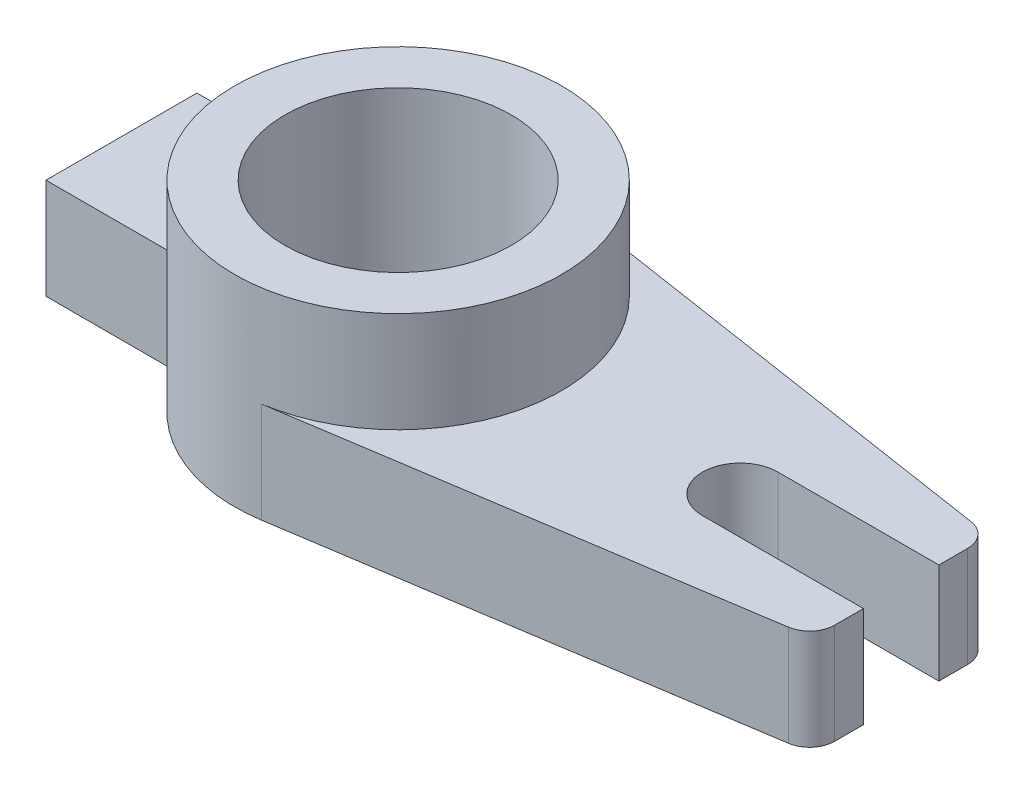
ISO-10303-21;
HEADER;
FILE_DESCRIPTION(('STEP AP214'),'2;1');
FILE_NAME('part.step','',(''),(''),'','','');
FILE_SCHEMA(('AUTOMOTIVE_DESIGN { 1 0 10303 214 1 1 1 1 }'));
ENDSEC;
DATA;
#1=APPLICATION_CONTEXT('core data for automotive mechanical design processes');
#2=APPLICATION_PROTOCOL_DEFINITION('international standard','automotive_design',2000,#1);
#3=PRODUCT_CONTEXT('',#1,'mechanical');
#4=PRODUCT('Part','Part','',(#3));
#5=PRODUCT_RELATED_PRODUCT_CATEGORY('part','',(#4));
#6=PRODUCT_DEFINITION_FORMATION('','',#4);
#7=PRODUCT_DEFINITION_CONTEXT('part definition',#1,'design');
#8=PRODUCT_DEFINITION('design','',#6,#7);
#9=PRODUCT_DEFINITION_SHAPE('','',#8);
#10=(LENGTH_UNIT() NAMED_UNIT(*) SI_UNIT(.MILLI.,.METRE.));
#11=(NAMED_UNIT(*) PLANE_ANGLE_UNIT() SI_UNIT($,.RADIAN.));
#12=(NAMED_UNIT(*) SI_UNIT($,.STERADIAN.) SOLID_ANGLE_UNIT());
#13=UNCERTAINTY_MEASURE_WITH_UNIT(LENGTH_MEASURE(1.E-05),#10,'distance_accuracy_value','');
#14=(GEOMETRIC_REPRESENTATION_CONTEXT(3) GLOBAL_UNCERTAINTY_ASSIGNED_CONTEXT((#13)) GLOBAL_UNIT_ASSIGNED_CONTEXT((#10,
#11,#12)) REPRESENTATION_CONTEXT('',''));
#15=CARTESIAN_POINT('',(0.,0.,0.));
#16=DIRECTION('',(0.,0.,1.));
#17=DIRECTION('',(1.,0.,0.));
#18=AXIS2_PLACEMENT_3D('',#15,#16,#17);
#19=CARTESIAN_POINT('',(0.,20.,0.));
#20=DIRECTION('',(0.,1.,0.));
#21=DIRECTION('',(0.,0.,1.));
#22=AXIS2_PLACEMENT_3D('',#19,#20,#21);
#23=PLANE('',#22);
#24=DIRECTION('',(-1.,0.,0.));
#25=VECTOR('',#24,1.);
#26=CARTESIAN_POINT('',(0.,20.,15.));
#27=LINE('',#26,#25);
#28=CARTESIAN_POINT('',(-28.831406486677,20.,15.));
#29=VERTEX_POINT('',#28);
#30=CARTESIAN_POINT('',(-55.,20.,15.));
#31=VERTEX_POINT('',#30);
#32=EDGE_CURVE('E153',#29,#31,#27,.T.);
#33=ORIENTED_EDGE('',*,*,#32,.F.);
#34=CARTESIAN_POINT('',(0.,20.,0.));
#35=DIRECTION('',(0.,1.,0.));
#36=DIRECTION('',(0.,0.,1.));
#37=AXIS2_PLACEMENT_3D('',#34,#35,#36);
#38=CIRCLE('',#37,32.5);
#39=CARTESIAN_POINT('',(-28.831406486677,20.,-15.));
#40=VERTEX_POINT('',#39);
#41=EDGE_CURVE('E148',#29,#40,#38,.F.);
#42=ORIENTED_EDGE('',*,*,#41,.T.);
#43=DIRECTION('',(1.,0.,0.));
#44=VECTOR('',#43,1.);
#45=CARTESIAN_POINT('',(0.,20.,-15.));
#46=LINE('',#45,#44);
#47=CARTESIAN_POINT('',(-55.,20.,-15.));
#48=VERTEX_POINT('',#47);
#49=EDGE_CURVE('E152',#48,#40,#46,.T.);
#50=ORIENTED_EDGE('',*,*,#49,.F.);
#51=DIRECTION('',(0.,0.,-1.));
#52=VECTOR('',#51,1.);
#53=CARTESIAN_POINT('',(-55.,20.,0.));
#54=LINE('',#53,#52);
#55=EDGE_CURVE('E173',#31,#48,#54,.T.);
#56=ORIENTED_EDGE('',*,*,#55,.F.);
#57=EDGE_LOOP('',(#33,#42,#50,#56));
#58=FACE_BOUND('',#57,.T.);
#59=ADVANCED_FACE('F45',(#58),#23,.T.);
#60=DIRECTION('',(-0.988375212209647,0.,-0.152034337863312));
#61=VECTOR('',#60,1.);
#62=CARTESIAN_POINT('',(4.94111598055764,20.,-32.1221943968135));
#63=LINE('',#62,#61);
#64=CARTESIAN_POINT('',(95.7601716893165,20.,-18.1521809550725));
#65=VERTEX_POINT('',#64);
#66=CARTESIAN_POINT('',(4.94111598055764,20.,-32.1221943968135));
#67=VERTEX_POINT('',#66);
#68=EDGE_CURVE('E174',#65,#67,#63,.T.);
#69=ORIENTED_EDGE('',*,*,#68,.T.);
#70=CARTESIAN_POINT('',(4.94111598055764,20.,32.1221943968135));
#71=VERTEX_POINT('',#70);
#72=EDGE_CURVE('E157',#67,#71,#38,.F.);
#73=ORIENTED_EDGE('',*,*,#72,.T.);
#74=DIRECTION('',(-0.988375212209647,0.,0.152034337863312));
#75=VECTOR('',#74,1.);
#76=CARTESIAN_POINT('',(4.94111598055764,20.,32.1221943968135));
#77=LINE('',#76,#75);
#78=CARTESIAN_POINT('',(95.7601716893165,20.,18.1521809550725));
#79=VERTEX_POINT('',#78);
#80=EDGE_CURVE('E271',#79,#71,#77,.T.);
#81=ORIENTED_EDGE('',*,*,#80,.F.);
#82=CARTESIAN_POINT('',(95.,20.,13.2103048940243));
#83=DIRECTION('',(0.,1.,0.));
#84=DIRECTION('',(0.,0.,1.));
#85=AXIS2_PLACEMENT_3D('',#82,#83,#84);
#86=CIRCLE('',#85,5.);
#87=CARTESIAN_POINT('',(100.,20.,13.2103048940242));
#88=VERTEX_POINT('',#87);
#89=EDGE_CURVE('E294',#79,#88,#86,.T.);
#90=ORIENTED_EDGE('',*,*,#89,.T.);
#91=DIRECTION('',(0.,0.,-1.));
#92=VECTOR('',#91,1.);
#93=CARTESIAN_POINT('',(100.,20.,0.));
#94=LINE('',#93,#92);
#95=CARTESIAN_POINT('',(100.,20.,7.5));
#96=VERTEX_POINT('',#95);
#97=EDGE_CURVE('E289',#88,#96,#94,.T.);
#98=ORIENTED_EDGE('',*,*,#97,.T.);
#99=DIRECTION('',(-1.,0.,0.));
#100=VECTOR('',#99,1.);
#101=CARTESIAN_POINT('',(0.,20.,7.49999999999999));
#102=LINE('',#101,#100);
#103=CARTESIAN_POINT('',(68.,20.,7.5));
#104=VERTEX_POINT('',#103);
#105=EDGE_CURVE('E293',#96,#104,#102,.T.);
#106=ORIENTED_EDGE('',*,*,#105,.T.);
#107=CARTESIAN_POINT('',(68.,20.,0.));
#108=DIRECTION('',(0.,1.,0.));
#109=DIRECTION('',(0.,0.,1.));
#110=AXIS2_PLACEMENT_3D('',#107,#108,#109);
#111=CIRCLE('',#110,7.5);
#112=CARTESIAN_POINT('',(68.,20.,-7.5));
#113=VERTEX_POINT('',#112);
#114=EDGE_CURVE('E298',#113,#104,#111,.T.);
#115=ORIENTED_EDGE('',*,*,#114,.F.);
#116=DIRECTION('',(-1.,0.,0.));
#117=VECTOR('',#116,1.);
#118=CARTESIAN_POINT('',(0.,20.,-7.49999999999999));
#119=LINE('',#118,#117);
#120=CARTESIAN_POINT('',(100.,20.,-7.5));
#121=VERTEX_POINT('',#120);
#122=EDGE_CURVE('E306',#121,#113,#119,.T.);
#123=ORIENTED_EDGE('',*,*,#122,.F.);
#124=DIRECTION('',(0.,0.,1.));
#125=VECTOR('',#124,1.);
#126=CARTESIAN_POINT('',(100.,20.,0.));
#127=LINE('',#126,#125);
#128=CARTESIAN_POINT('',(100.,20.,-13.2103048940242));
#129=VERTEX_POINT('',#128);
#130=EDGE_CURVE('E310',#129,#121,#127,.T.);
#131=ORIENTED_EDGE('',*,*,#130,.F.);
#132=CARTESIAN_POINT('',(95.,20.,-13.2103048940243));
#133=DIRECTION('',(0.,1.,0.));
#134=DIRECTION('',(0.,0.,1.));
#135=AXIS2_PLACEMENT_3D('',#132,#133,#134);
#136=CIRCLE('',#135,5.);
#137=EDGE_CURVE('E179',#129,#65,#136,.T.);
#138=ORIENTED_EDGE('',*,*,#137,.T.);
#139=EDGE_LOOP('',(#69,#73,#81,#90,#98,#106,#115,#123,#131,#138));
#140=FACE_BOUND('',#139,.T.);
#141=ADVANCED_FACE('F317',(#140),#23,.T.);
#142=CARTESIAN_POINT('',(0.,20.,15.));
#143=DIRECTION('',(0.,0.,1.));
#144=DIRECTION('',(1.,0.,0.));
#145=AXIS2_PLACEMENT_3D('',#142,#143,#144);
#146=PLANE('',#145);
#147=DIRECTION('',(-1.,0.,0.));
#148=VECTOR('',#147,1.);
#149=CARTESIAN_POINT('',(0.,0.,15.));
#150=LINE('',#149,#148);
#151=CARTESIAN_POINT('',(-28.831406486677,0.,15.));
#152=VERTEX_POINT('',#151);
#153=CARTESIAN_POINT('',(-55.,0.,15.));
#154=VERTEX_POINT('',#153);
#155=EDGE_CURVE('E156',#152,#154,#150,.T.);
#156=ORIENTED_EDGE('',*,*,#155,.F.);
#157=DIRECTION('',(0.,-1.,0.));
#158=VECTOR('',#157,1.);
#159=CARTESIAN_POINT('',(-28.831406486677,20.,15.));
#160=LINE('',#159,#158);
#161=EDGE_CURVE('E11',#29,#152,#160,.T.);
#162=ORIENTED_EDGE('',*,*,#161,.F.);
#163=ORIENTED_EDGE('',*,*,#32,.T.);
#164=DIRECTION('',(0.,-1.,0.));
#165=VECTOR('',#164,1.);
#166=CARTESIAN_POINT('',(-55.,20.,15.));
#167=LINE('',#166,#165);
#168=EDGE_CURVE('E63',#31,#154,#167,.T.);
#169=ORIENTED_EDGE('',*,*,#168,.T.);
#170=EDGE_LOOP('',(#156,#162,#163,#169));
#171=FACE_BOUND('',#170,.T.);
#172=ADVANCED_FACE('F47',(#171),#146,.T.);
#173=CARTESIAN_POINT('',(4.94111598055764,20.,32.1221943968135));
#174=DIRECTION('',(0.152034337863312,0.,0.988375212209647));
#175=DIRECTION('',(0.988375212209647,0.,-0.152034337863312));
#176=AXIS2_PLACEMENT_3D('',#173,#174,#175);
#177=PLANE('',#176);
#178=DIRECTION('',(-0.988375212209647,0.,0.152034337863312));
#179=VECTOR('',#178,1.);
#180=CARTESIAN_POINT('',(4.94111598055764,0.,32.1221943968135));
#181=LINE('',#180,#179);
#182=CARTESIAN_POINT('',(95.7601716893165,0.,18.1521809550725));
#183=VERTEX_POINT('',#182);
#184=CARTESIAN_POINT('',(4.94111598055764,0.,32.1221943968135));
#185=VERTEX_POINT('',#184);
#186=EDGE_CURVE('E189',#183,#185,#181,.T.);
#187=ORIENTED_EDGE('',*,*,#186,.F.);
#188=DIRECTION('',(0.,-1.,0.));
#189=VECTOR('',#188,1.);
#190=CARTESIAN_POINT('',(95.7601716893165,20.,18.1521809550725));
#191=LINE('',#190,#189);
#192=EDGE_CURVE('E262',#79,#183,#191,.T.);
#193=ORIENTED_EDGE('',*,*,#192,.F.);
#194=ORIENTED_EDGE('',*,*,#80,.T.);
#195=DIRECTION('',(0.,-1.,0.));
#196=VECTOR('',#195,1.);
#197=CARTESIAN_POINT('',(4.94111598055764,20.,32.1221943968135));
#198=LINE('',#197,#196);
#199=EDGE_CURVE('E55',#71,#185,#198,.T.);
#200=ORIENTED_EDGE('',*,*,#199,.T.);
#201=EDGE_LOOP('',(#187,#193,#194,#200));
#202=FACE_BOUND('',#201,.T.);
#203=ADVANCED_FACE('F269',(#202),#177,.T.);
#204=CARTESIAN_POINT('',(95.,20.,13.2103048940243));
#205=DIRECTION('',(0.,-1.,0.));
#206=DIRECTION('',(0.,0.,-1.));
#207=AXIS2_PLACEMENT_3D('',#204,#205,#206);
#208=CYLINDRICAL_SURFACE('',#207,5.);
#209=CARTESIAN_POINT('',(95.,0.,13.2103048940243));
#210=DIRECTION('',(0.,1.,0.));
#211=DIRECTION('',(0.,0.,1.));
#212=AXIS2_PLACEMENT_3D('',#209,#210,#211);
#213=CIRCLE('',#212,5.);
#214=CARTESIAN_POINT('',(100.,0.,13.2103048940242));
#215=VERTEX_POINT('',#214);
#216=EDGE_CURVE('E193',#183,#215,#213,.T.);
#217=ORIENTED_EDGE('',*,*,#216,.T.);
#218=DIRECTION('',(0.,-1.,0.));
#219=VECTOR('',#218,1.);
#220=CARTESIAN_POINT('',(100.,20.,13.2103048940242));
#221=LINE('',#220,#219);
#222=EDGE_CURVE('E258',#88,#215,#221,.T.);
#223=ORIENTED_EDGE('',*,*,#222,.F.);
#224=ORIENTED_EDGE('',*,*,#89,.F.);
#225=ORIENTED_EDGE('',*,*,#192,.T.);
#226=EDGE_LOOP('',(#217,#223,#224,#225));
#227=FACE_BOUND('',#226,.T.);
#228=ADVANCED_FACE('F283',(#227),#208,.T.);
#229=CARTESIAN_POINT('',(100.,20.,0.));
#230=DIRECTION('',(-1.,0.,0.));
#231=DIRECTION('',(0.,0.,1.));
#232=AXIS2_PLACEMENT_3D('',#229,#230,#231);
#233=PLANE('',#232);
#234=DIRECTION('',(0.,0.,-1.));
#235=VECTOR('',#234,1.);
#236=CARTESIAN_POINT('',(100.,0.,0.));
#237=LINE('',#236,#235);
#238=CARTESIAN_POINT('',(100.,0.,7.5));
#239=VERTEX_POINT('',#238);
#240=EDGE_CURVE('E196',#215,#239,#237,.T.);
#241=ORIENTED_EDGE('',*,*,#240,.T.);
#242=DIRECTION('',(0.,-1.,0.));
#243=VECTOR('',#242,1.);
#244=CARTESIAN_POINT('',(100.,20.,7.5));
#245=LINE('',#244,#243);
#246=EDGE_CURVE('E254',#96,#239,#245,.T.);
#247=ORIENTED_EDGE('',*,*,#246,.F.);
#248=ORIENTED_EDGE('',*,*,#97,.F.);
#249=ORIENTED_EDGE('',*,*,#222,.T.);
#250=EDGE_LOOP('',(#241,#247,#248,#249));
#251=FACE_BOUND('',#250,.T.);
#252=ADVANCED_FACE('F287',(#251),#233,.F.);
#253=CARTESIAN_POINT('',(0.,20.,7.49999999999999));
#254=DIRECTION('',(0.,0.,1.));
#255=DIRECTION('',(1.,0.,0.));
#256=AXIS2_PLACEMENT_3D('',#253,#254,#255);
#257=PLANE('',#256);
#258=DIRECTION('',(-1.,0.,0.));
#259=VECTOR('',#258,1.);
#260=CARTESIAN_POINT('',(0.,0.,7.49999999999999));
#261=LINE('',#260,#259);
#262=CARTESIAN_POINT('',(68.,0.,7.5));
#263=VERTEX_POINT('',#262);
#264=EDGE_CURVE('E199',#239,#263,#261,.T.);
#265=ORIENTED_EDGE('',*,*,#264,.T.);
#266=DIRECTION('',(0.,-1.,0.));
#267=VECTOR('',#266,1.);
#268=CARTESIAN_POINT('',(68.,20.,7.5));
#269=LINE('',#268,#267);
#270=EDGE_CURVE('E251',#104,#263,#269,.T.);
#271=ORIENTED_EDGE('',*,*,#270,.F.);
#272=ORIENTED_EDGE('',*,*,#105,.F.);
#273=ORIENTED_EDGE('',*,*,#246,.T.);
#274=EDGE_LOOP('',(#265,#271,#272,#273));
#275=FACE_BOUND('',#274,.T.);
#276=ADVANCED_FACE('F388',(#275),#257,.F.);
#277=CARTESIAN_POINT('',(68.,20.,0.));
#278=DIRECTION('',(0.,-1.,0.));
#279=DIRECTION('',(0.,0.,-1.));
#280=AXIS2_PLACEMENT_3D('',#277,#278,#279);
#281=CYLINDRICAL_SURFACE('',#280,7.5);
#282=CARTESIAN_POINT('',(68.,0.,0.));
#283=DIRECTION('',(0.,1.,0.));
#284=DIRECTION('',(0.,0.,1.));
#285=AXIS2_PLACEMENT_3D('',#282,#283,#284);
#286=CIRCLE('',#285,7.5);
#287=CARTESIAN_POINT('',(68.,0.,-7.5));
#288=VERTEX_POINT('',#287);
#289=EDGE_CURVE('E203',#288,#263,#286,.T.);
#290=ORIENTED_EDGE('',*,*,#289,.F.);
#291=DIRECTION('',(0.,-1.,0.));
#292=VECTOR('',#291,1.);
#293=CARTESIAN_POINT('',(68.,20.,-7.5));
#294=LINE('',#293,#292);
#295=EDGE_CURVE('E248',#113,#288,#294,.T.);
#296=ORIENTED_EDGE('',*,*,#295,.F.);
#297=ORIENTED_EDGE('',*,*,#114,.T.);
#298=ORIENTED_EDGE('',*,*,#270,.T.);
#299=EDGE_LOOP('',(#290,#296,#297,#298));
#300=FACE_BOUND('',#299,.T.);
#301=ADVANCED_FACE('F384',(#300),#281,.F.);
#302=CARTESIAN_POINT('',(0.,20.,-7.49999999999999));
#303=DIRECTION('',(0.,0.,1.));
#304=DIRECTION('',(1.,0.,0.));
#305=AXIS2_PLACEMENT_3D('',#302,#303,#304);
#306=PLANE('',#305);
#307=DIRECTION('',(-1.,0.,0.));
#308=VECTOR('',#307,1.);
#309=CARTESIAN_POINT('',(0.,0.,-7.49999999999999));
#310=LINE('',#309,#308);
#311=CARTESIAN_POINT('',(100.,0.,-7.5));
#312=VERTEX_POINT('',#311);
#313=EDGE_CURVE('E207',#312,#288,#310,.T.);
#314=ORIENTED_EDGE('',*,*,#313,.F.);
#315=DIRECTION('',(0.,-1.,0.));
#316=VECTOR('',#315,1.);
#317=CARTESIAN_POINT('',(100.,20.,-7.5));
#318=LINE('',#317,#316);
#319=EDGE_CURVE('E245',#121,#312,#318,.T.);
#320=ORIENTED_EDGE('',*,*,#319,.F.);
#321=ORIENTED_EDGE('',*,*,#122,.T.);
#322=ORIENTED_EDGE('',*,*,#295,.T.);
#323=EDGE_LOOP('',(#314,#320,#321,#322));
#324=FACE_BOUND('',#323,.T.);
#325=ADVANCED_FACE('F380',(#324),#306,.T.);
#326=CARTESIAN_POINT('',(100.,20.,0.));
#327=DIRECTION('',(1.,0.,0.));
#328=DIRECTION('',(0.,0.,-1.));
#329=AXIS2_PLACEMENT_3D('',#326,#327,#328);
#330=PLANE('',#329);
#331=DIRECTION('',(0.,0.,1.));
#332=VECTOR('',#331,1.);
#333=CARTESIAN_POINT('',(100.,0.,0.));
#334=LINE('',#333,#332);
#335=CARTESIAN_POINT('',(100.,0.,-13.2103048940242));
#336=VERTEX_POINT('',#335);
#337=EDGE_CURVE('E211',#336,#312,#334,.T.);
#338=ORIENTED_EDGE('',*,*,#337,.F.);
#339=DIRECTION('',(0.,-1.,0.));
#340=VECTOR('',#339,1.);
#341=CARTESIAN_POINT('',(100.,20.,-13.2103048940242));
#342=LINE('',#341,#340);
#343=EDGE_CURVE('E242',#129,#336,#342,.T.);
#344=ORIENTED_EDGE('',*,*,#343,.F.);
#345=ORIENTED_EDGE('',*,*,#130,.T.);
#346=ORIENTED_EDGE('',*,*,#319,.T.);
#347=EDGE_LOOP('',(#338,#344,#345,#346));
#348=FACE_BOUND('',#347,.T.);
#349=ADVANCED_FACE('F377',(#348),#330,.T.);
#350=CARTESIAN_POINT('',(95.,20.,-13.2103048940243));
#351=DIRECTION('',(0.,-1.,0.));
#352=DIRECTION('',(0.,0.,-1.));
#353=AXIS2_PLACEMENT_3D('',#350,#351,#352);
#354=CYLINDRICAL_SURFACE('',#353,5.);
#355=CARTESIAN_POINT('',(95.,0.,-13.2103048940243));
#356=DIRECTION('',(0.,1.,0.));
#357=DIRECTION('',(0.,0.,1.));
#358=AXIS2_PLACEMENT_3D('',#355,#356,#357);
#359=CIRCLE('',#358,5.);
#360=CARTESIAN_POINT('',(95.7601716893165,0.,-18.1521809550725));
#361=VERTEX_POINT('',#360);
#362=EDGE_CURVE('E215',#336,#361,#359,.T.);
#363=ORIENTED_EDGE('',*,*,#362,.T.);
#364=DIRECTION('',(0.,-1.,0.));
#365=VECTOR('',#364,1.);
#366=CARTESIAN_POINT('',(95.7601716893165,20.,-18.1521809550725));
#367=LINE('',#366,#365);
#368=EDGE_CURVE('E238',#65,#361,#367,.T.);
#369=ORIENTED_EDGE('',*,*,#368,.F.);
#370=ORIENTED_EDGE('',*,*,#137,.F.);
#371=ORIENTED_EDGE('',*,*,#343,.T.);
#372=EDGE_LOOP('',(#363,#369,#370,#371));
#373=FACE_BOUND('',#372,.T.);
#374=ADVANCED_FACE('F322',(#373),#354,.T.);
#375=CARTESIAN_POINT('',(4.94111598055764,20.,-32.1221943968135));
#376=DIRECTION('',(-0.152034337863312,0.,0.988375212209647));
#377=DIRECTION('',(0.988375212209647,0.,0.152034337863312));
#378=AXIS2_PLACEMENT_3D('',#375,#376,#377);
#379=PLANE('',#378);
#380=DIRECTION('',(-0.988375212209647,0.,-0.152034337863312));
#381=VECTOR('',#380,1.);
#382=CARTESIAN_POINT('',(4.94111598055764,0.,-32.1221943968135));
#383=LINE('',#382,#381);
#384=CARTESIAN_POINT('',(4.94111598055764,0.,-32.1221943968135));
#385=VERTEX_POINT('',#384);
#386=EDGE_CURVE('E218',#361,#385,#383,.T.);
#387=ORIENTED_EDGE('',*,*,#386,.T.);
#388=DIRECTION('',(0.,-1.,0.));
#389=VECTOR('',#388,1.);
#390=CARTESIAN_POINT('',(4.94111598055764,20.,-32.1221943968135));
#391=LINE('',#390,#389);
#392=EDGE_CURVE('E169',#67,#385,#391,.T.);
#393=ORIENTED_EDGE('',*,*,#392,.F.);
#394=ORIENTED_EDGE('',*,*,#68,.F.);
#395=ORIENTED_EDGE('',*,*,#368,.T.);
#396=EDGE_LOOP('',(#387,#393,#394,#395));
#397=FACE_BOUND('',#396,.T.);
#398=ADVANCED_FACE('F326',(#397),#379,.F.);
#399=CARTESIAN_POINT('',(0.,20.,0.));
#400=DIRECTION('',(0.,-1.,0.));
#401=DIRECTION('',(0.,0.,-1.));
#402=AXIS2_PLACEMENT_3D('',#399,#400,#401);
#403=CYLINDRICAL_SURFACE('',#402,32.5);
#404=CARTESIAN_POINT('',(0.,0.,0.));
#405=DIRECTION('',(0.,1.,0.));
#406=DIRECTION('',(0.,0.,1.));
#407=AXIS2_PLACEMENT_3D('',#404,#405,#406);
#408=CIRCLE('',#407,32.5);
#409=CARTESIAN_POINT('',(-28.831406486677,0.,-15.));
#410=VERTEX_POINT('',#409);
#411=EDGE_CURVE('E165',#385,#410,#408,.T.);
#412=ORIENTED_EDGE('',*,*,#411,.T.);
#413=DIRECTION('',(0.,-1.,0.));
#414=VECTOR('',#413,1.);
#415=CARTESIAN_POINT('',(-28.831406486677,20.,-15.));
#416=LINE('',#415,#414);
#417=EDGE_CURVE('E160',#40,#410,#416,.T.);
#418=ORIENTED_EDGE('',*,*,#417,.F.);
#419=ORIENTED_EDGE('',*,*,#41,.F.);
#420=ORIENTED_EDGE('',*,*,#161,.T.);
#421=EDGE_CURVE('E185',#152,#185,#408,.T.);
#422=ORIENTED_EDGE('',*,*,#421,.T.);
#423=ORIENTED_EDGE('',*,*,#199,.F.);
#424=ORIENTED_EDGE('',*,*,#72,.F.);
#425=ORIENTED_EDGE('',*,*,#392,.T.);
#426=EDGE_LOOP('',(#412,#418,#419,#420,#422,#423,#424,#425));
#427=FACE_BOUND('',#426,.T.);
#428=CARTESIAN_POINT('',(0.,40.,0.));
#429=DIRECTION('',(0.,1.,0.));
#430=DIRECTION('',(0.,0.,1.));
#431=AXIS2_PLACEMENT_3D('',#428,#429,#430);
#432=CIRCLE('',#431,32.5);
#433=CARTESIAN_POINT('',(0.,40.,32.5));
#434=VERTEX_POINT('',#433);
#435=EDGE_CURVE('E328',#434,#434,#432,.T.);
#436=ORIENTED_EDGE('',*,*,#435,.F.);
#437=EDGE_LOOP('',(#436));
#438=FACE_BOUND('',#437,.T.);
#439=ADVANCED_FACE('F161',(#427,#438),#403,.T.);
#440=CARTESIAN_POINT('',(0.,20.,-15.));
#441=DIRECTION('',(0.,0.,-1.));
#442=DIRECTION('',(-1.,0.,0.));
#443=AXIS2_PLACEMENT_3D('',#440,#441,#442);
#444=PLANE('',#443);
#445=DIRECTION('',(1.,0.,0.));
#446=VECTOR('',#445,1.);
#447=CARTESIAN_POINT('',(0.,0.,-15.));
#448=LINE('',#447,#446);
#449=CARTESIAN_POINT('',(-55.,0.,-15.));
#450=VERTEX_POINT('',#449);
#451=EDGE_CURVE('E221',#450,#410,#448,.T.);
#452=ORIENTED_EDGE('',*,*,#451,.F.);
#453=DIRECTION('',(0.,-1.,0.));
#454=VECTOR('',#453,1.);
#455=CARTESIAN_POINT('',(-55.,20.,-15.));
#456=LINE('',#455,#454);
#457=EDGE_CURVE('E107',#48,#450,#456,.T.);
#458=ORIENTED_EDGE('',*,*,#457,.F.);
#459=ORIENTED_EDGE('',*,*,#49,.T.);
#460=ORIENTED_EDGE('',*,*,#417,.T.);
#461=EDGE_LOOP('',(#452,#458,#459,#460));
#462=FACE_BOUND('',#461,.T.);
#463=ADVANCED_FACE('F171',(#462),#444,.T.);
#464=CARTESIAN_POINT('',(-55.,20.,0.));
#465=DIRECTION('',(-1.,0.,0.));
#466=DIRECTION('',(0.,0.,1.));
#467=AXIS2_PLACEMENT_3D('',#464,#465,#466);
#468=PLANE('',#467);
#469=DIRECTION('',(0.,0.,-1.));
#470=VECTOR('',#469,1.);
#471=CARTESIAN_POINT('',(-55.,0.,0.));
#472=LINE('',#471,#470);
#473=EDGE_CURVE('E224',#154,#450,#472,.T.);
#474=ORIENTED_EDGE('',*,*,#473,.F.);
#475=ORIENTED_EDGE('',*,*,#168,.F.);
#476=ORIENTED_EDGE('',*,*,#55,.T.);
#477=ORIENTED_EDGE('',*,*,#457,.T.);
#478=EDGE_LOOP('',(#474,#475,#476,#477));
#479=FACE_BOUND('',#478,.T.);
#480=ADVANCED_FACE('F338',(#479),#468,.T.);
#481=CARTESIAN_POINT('',(0.,20.,0.));
#482=DIRECTION('',(0.,-1.,0.));
#483=DIRECTION('',(0.,0.,-1.));
#484=AXIS2_PLACEMENT_3D('',#481,#482,#483);
#485=CYLINDRICAL_SURFACE('',#484,22.5);
#486=CARTESIAN_POINT('',(0.,0.,0.));
#487=DIRECTION('',(0.,1.,0.));
#488=DIRECTION('',(0.,0.,1.));
#489=AXIS2_PLACEMENT_3D('',#486,#487,#488);
#490=CIRCLE('',#489,22.5);
#491=CARTESIAN_POINT('',(0.,0.,22.5));
#492=VERTEX_POINT('',#491);
#493=EDGE_CURVE('E228',#492,#492,#490,.T.);
#494=ORIENTED_EDGE('',*,*,#493,.F.);
#495=EDGE_LOOP('',(#494));
#496=FACE_BOUND('',#495,.T.);
#497=CARTESIAN_POINT('',(0.,40.,0.));
#498=DIRECTION('',(0.,1.,0.));
#499=DIRECTION('',(0.,0.,1.));
#500=AXIS2_PLACEMENT_3D('',#497,#498,#499);
#501=CIRCLE('',#500,22.5);
#502=CARTESIAN_POINT('',(0.,40.,22.5));
#503=VERTEX_POINT('',#502);
#504=EDGE_CURVE('E331',#503,#503,#501,.T.);
#505=ORIENTED_EDGE('',*,*,#504,.T.);
#506=EDGE_LOOP('',(#505));
#507=FACE_BOUND('',#506,.T.);
#508=ADVANCED_FACE('F340',(#496,#507),#485,.F.);
#509=CARTESIAN_POINT('',(0.,0.,0.));
#510=DIRECTION('',(0.,1.,0.));
#511=DIRECTION('',(0.,0.,1.));
#512=AXIS2_PLACEMENT_3D('',#509,#510,#511);
#513=PLANE('',#512);
#514=ORIENTED_EDGE('',*,*,#421,.F.);
#515=ORIENTED_EDGE('',*,*,#155,.T.);
#516=ORIENTED_EDGE('',*,*,#473,.T.);
#517=ORIENTED_EDGE('',*,*,#451,.T.);
#518=ORIENTED_EDGE('',*,*,#411,.F.);
#519=ORIENTED_EDGE('',*,*,#386,.F.);
#520=ORIENTED_EDGE('',*,*,#362,.F.);
#521=ORIENTED_EDGE('',*,*,#337,.T.);
#522=ORIENTED_EDGE('',*,*,#313,.T.);
#523=ORIENTED_EDGE('',*,*,#289,.T.);
#524=ORIENTED_EDGE('',*,*,#264,.F.);
#525=ORIENTED_EDGE('',*,*,#240,.F.);
#526=ORIENTED_EDGE('',*,*,#216,.F.);
#527=ORIENTED_EDGE('',*,*,#186,.T.);
#528=EDGE_LOOP('',(#514,#515,#516,#517,#518,#519,#520,#521,#522,#523,#524,#525,#526,#527));
#529=FACE_BOUND('',#528,.T.);
#530=ORIENTED_EDGE('',*,*,#493,.T.);
#531=EDGE_LOOP('',(#530));
#532=FACE_BOUND('',#531,.T.);
#533=ADVANCED_FACE('F277',(#529,#532),#513,.F.);
#534=CARTESIAN_POINT('',(0.,40.,0.));
#535=DIRECTION('',(0.,1.,0.));
#536=DIRECTION('',(0.,0.,1.));
#537=AXIS2_PLACEMENT_3D('',#534,#535,#536);
#538=PLANE('',#537);
#539=ORIENTED_EDGE('',*,*,#504,.F.);
#540=EDGE_LOOP('',(#539));
#541=FACE_BOUND('',#540,.T.);
#542=ORIENTED_EDGE('',*,*,#435,.T.);
#543=EDGE_LOOP('',(#542));
#544=FACE_BOUND('',#543,.T.);
#545=ADVANCED_FACE('F357',(#541,#544),#538,.T.);
#546=CLOSED_SHELL('',(#59,#141,#172,#203,#228,#252,#276,#301,#325,#349,#374,#398,#439,#463,#480,
#508,#533,#545));
#547=MANIFOLD_SOLID_BREP('B2',#546);
#548=ADVANCED_BREP_SHAPE_REPRESENTATION('',(#18,#547),#14);
#549=SHAPE_DEFINITION_REPRESENTATION(#9,#548);
ENDSEC;
END-ISO-10303-21;
